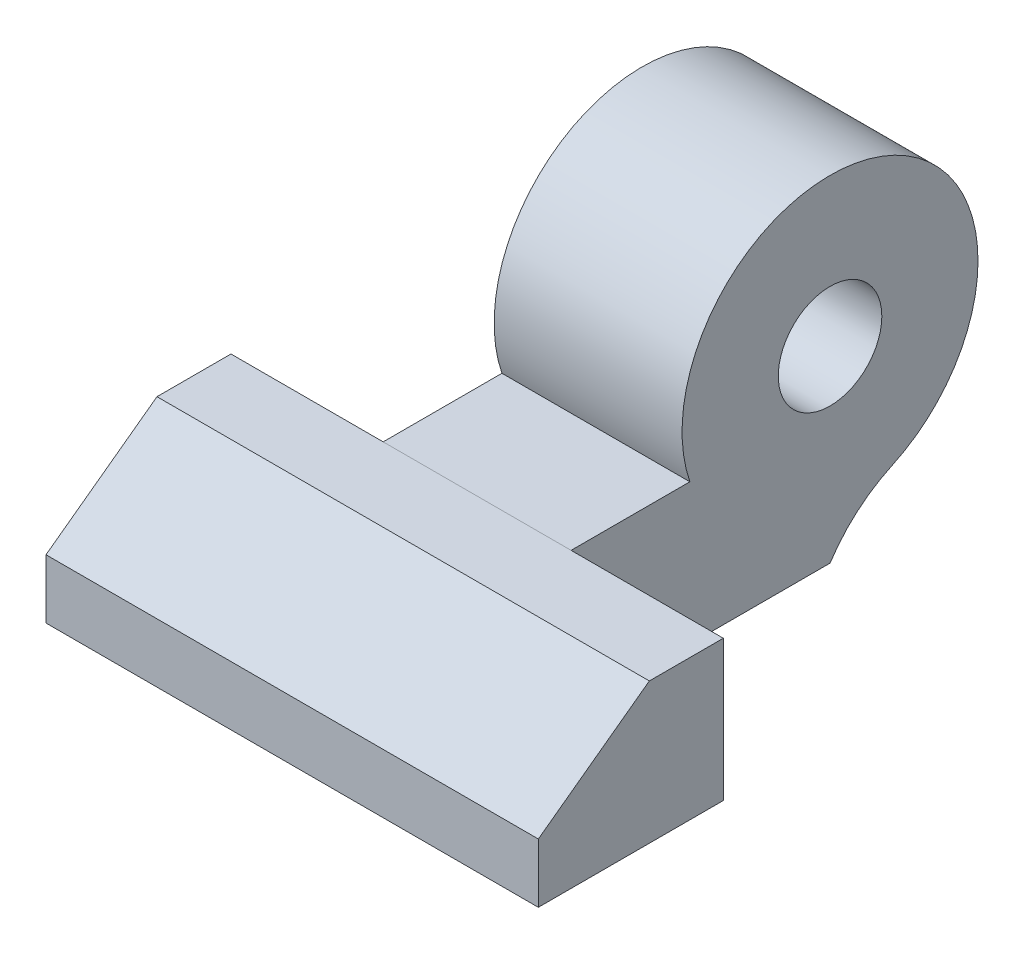
ISO-10303-21;
HEADER;
FILE_DESCRIPTION(('STEP AP214'),'2;1');
FILE_NAME('part.step','',(''),(''),'','','');
FILE_SCHEMA(('AUTOMOTIVE_DESIGN { 1 0 10303 214 1 1 1 1 }'));
ENDSEC;
DATA;
#1=APPLICATION_CONTEXT('core data for automotive mechanical design processes');
#2=APPLICATION_PROTOCOL_DEFINITION('international standard','automotive_design',2000,#1);
#3=PRODUCT_CONTEXT('',#1,'mechanical');
#4=PRODUCT('Part','Part','',(#3));
#5=PRODUCT_RELATED_PRODUCT_CATEGORY('part','',(#4));
#6=PRODUCT_DEFINITION_FORMATION('','',#4);
#7=PRODUCT_DEFINITION_CONTEXT('part definition',#1,'design');
#8=PRODUCT_DEFINITION('design','',#6,#7);
#9=PRODUCT_DEFINITION_SHAPE('','',#8);
#10=(LENGTH_UNIT() NAMED_UNIT(*) SI_UNIT(.MILLI.,.METRE.));
#11=(NAMED_UNIT(*) PLANE_ANGLE_UNIT() SI_UNIT($,.RADIAN.));
#12=(NAMED_UNIT(*) SI_UNIT($,.STERADIAN.) SOLID_ANGLE_UNIT());
#13=UNCERTAINTY_MEASURE_WITH_UNIT(LENGTH_MEASURE(1.E-05),#10,'distance_accuracy_value','');
#14=(GEOMETRIC_REPRESENTATION_CONTEXT(3) GLOBAL_UNCERTAINTY_ASSIGNED_CONTEXT((#13)) GLOBAL_UNIT_ASSIGNED_CONTEXT((#10,
#11,#12)) REPRESENTATION_CONTEXT('',''));
#15=CARTESIAN_POINT('',(0.,0.,0.));
#16=DIRECTION('',(0.,0.,1.));
#17=DIRECTION('',(1.,0.,0.));
#18=AXIS2_PLACEMENT_3D('',#15,#16,#17);
#19=CARTESIAN_POINT('',(16.637,0.,30.));
#20=DIRECTION('',(0.,0.,-1.));
#21=DIRECTION('',(-1.,0.,0.));
#22=AXIS2_PLACEMENT_3D('',#19,#20,#21);
#23=PLANE('',#22);
#24=DIRECTION('',(0.,-1.,0.));
#25=VECTOR('',#24,1.);
#26=CARTESIAN_POINT('',(-16.637,0.,30.));
#27=LINE('',#26,#25);
#28=CARTESIAN_POINT('',(-16.637,-8.70000000000001,30.));
#29=VERTEX_POINT('',#28);
#30=CARTESIAN_POINT('',(-16.637,-12.7,30.));
#31=VERTEX_POINT('',#30);
#32=EDGE_CURVE('E127',#29,#31,#27,.T.);
#33=ORIENTED_EDGE('',*,*,#32,.T.);
#34=DIRECTION('',(-1.,0.,0.));
#35=VECTOR('',#34,1.);
#36=CARTESIAN_POINT('',(16.637,-12.7,30.));
#37=LINE('',#36,#35);
#38=CARTESIAN_POINT('',(16.637,-12.7,30.));
#39=VERTEX_POINT('',#38);
#40=EDGE_CURVE('E12',#39,#31,#37,.T.);
#41=ORIENTED_EDGE('',*,*,#40,.F.);
#42=DIRECTION('',(0.,-1.,0.));
#43=VECTOR('',#42,1.);
#44=CARTESIAN_POINT('',(16.637,0.,30.));
#45=LINE('',#44,#43);
#46=CARTESIAN_POINT('',(16.637,-8.70000000000001,30.));
#47=VERTEX_POINT('',#46);
#48=EDGE_CURVE('E121',#47,#39,#45,.T.);
#49=ORIENTED_EDGE('',*,*,#48,.F.);
#50=DIRECTION('',(-1.,0.,0.));
#51=VECTOR('',#50,1.);
#52=CARTESIAN_POINT('',(16.637,-8.70000000000001,30.));
#53=LINE('',#52,#51);
#54=EDGE_CURVE('E126',#47,#29,#53,.T.);
#55=ORIENTED_EDGE('',*,*,#54,.T.);
#56=EDGE_LOOP('',(#33,#41,#49,#55));
#57=FACE_BOUND('',#56,.T.);
#58=ADVANCED_FACE('F52',(#57),#23,.F.);
#59=CARTESIAN_POINT('',(16.637,-12.7,0.));
#60=DIRECTION('',(0.,1.,0.));
#61=DIRECTION('',(0.,0.,1.));
#62=AXIS2_PLACEMENT_3D('',#59,#60,#61);
#63=PLANE('',#62);
#64=DIRECTION('',(0.,0.,-1.));
#65=VECTOR('',#64,1.);
#66=CARTESIAN_POINT('',(-16.637,-12.7,0.));
#67=LINE('',#66,#65);
#68=CARTESIAN_POINT('',(-16.637,-12.7,17.5));
#69=VERTEX_POINT('',#68);
#70=EDGE_CURVE('E130',#31,#69,#67,.T.);
#71=ORIENTED_EDGE('',*,*,#70,.T.);
#72=DIRECTION('',(-1.,0.,0.));
#73=VECTOR('',#72,1.);
#74=CARTESIAN_POINT('',(16.637,-12.7,17.5));
#75=LINE('',#74,#73);
#76=CARTESIAN_POINT('',(16.637,-12.7,17.5));
#77=VERTEX_POINT('',#76);
#78=EDGE_CURVE('E60',#77,#69,#75,.T.);
#79=ORIENTED_EDGE('',*,*,#78,.F.);
#80=DIRECTION('',(0.,0.,-1.));
#81=VECTOR('',#80,1.);
#82=CARTESIAN_POINT('',(16.637,-12.7,0.));
#83=LINE('',#82,#81);
#84=EDGE_CURVE('E101',#39,#77,#83,.T.);
#85=ORIENTED_EDGE('',*,*,#84,.F.);
#86=ORIENTED_EDGE('',*,*,#40,.T.);
#87=EDGE_LOOP('',(#71,#79,#85,#86));
#88=FACE_BOUND('',#87,.T.);
#89=ADVANCED_FACE('F137',(#88),#63,.F.);
#90=CARTESIAN_POINT('',(16.637,0.,17.5));
#91=DIRECTION('',(0.,0.,-1.));
#92=DIRECTION('',(0.,1.,0.));
#93=AXIS2_PLACEMENT_3D('',#90,#91,#92);
#94=PLANE('',#93);
#95=DIRECTION('',(0.,-1.,0.));
#96=VECTOR('',#95,1.);
#97=CARTESIAN_POINT('',(-16.637,0.,17.5));
#98=LINE('',#97,#96);
#99=CARTESIAN_POINT('',(-16.637,-3.2,17.5));
#100=VERTEX_POINT('',#99);
#101=EDGE_CURVE('E113',#100,#69,#98,.T.);
#102=ORIENTED_EDGE('',*,*,#101,.F.);
#103=DIRECTION('',(-1.,0.,0.));
#104=VECTOR('',#103,1.);
#105=CARTESIAN_POINT('',(16.637,-3.2,17.5));
#106=LINE('',#105,#104);
#107=CARTESIAN_POINT('',(16.637,-3.2,17.5));
#108=VERTEX_POINT('',#107);
#109=EDGE_CURVE('E107',#108,#100,#106,.T.);
#110=ORIENTED_EDGE('',*,*,#109,.F.);
#111=DIRECTION('',(0.,-1.,0.));
#112=VECTOR('',#111,1.);
#113=CARTESIAN_POINT('',(16.637,0.,17.5));
#114=LINE('',#113,#112);
#115=EDGE_CURVE('E111',#108,#77,#114,.T.);
#116=ORIENTED_EDGE('',*,*,#115,.T.);
#117=ORIENTED_EDGE('',*,*,#78,.T.);
#118=EDGE_LOOP('',(#102,#110,#116,#117));
#119=FACE_BOUND('',#118,.T.);
#120=ADVANCED_FACE('F109',(#119),#94,.T.);
#121=CARTESIAN_POINT('',(16.637,-3.2,0.));
#122=DIRECTION('',(0.,-1.,0.));
#123=DIRECTION('',(0.,0.,-1.));
#124=AXIS2_PLACEMENT_3D('',#121,#122,#123);
#125=PLANE('',#124);
#126=DIRECTION('',(0.,0.,1.));
#127=VECTOR('',#126,1.);
#128=CARTESIAN_POINT('',(-16.637,-3.2,0.));
#129=LINE('',#128,#127);
#130=CARTESIAN_POINT('',(-16.637,-3.2,22.5));
#131=VERTEX_POINT('',#130);
#132=EDGE_CURVE('E87',#100,#131,#129,.T.);
#133=ORIENTED_EDGE('',*,*,#132,.T.);
#134=DIRECTION('',(-1.,0.,0.));
#135=VECTOR('',#134,1.);
#136=CARTESIAN_POINT('',(16.637,-3.2,22.5));
#137=LINE('',#136,#135);
#138=CARTESIAN_POINT('',(16.637,-3.2,22.5));
#139=VERTEX_POINT('',#138);
#140=EDGE_CURVE('E114',#139,#131,#137,.T.);
#141=ORIENTED_EDGE('',*,*,#140,.F.);
#142=DIRECTION('',(0.,0.,1.));
#143=VECTOR('',#142,1.);
#144=CARTESIAN_POINT('',(16.637,-3.2,0.));
#145=LINE('',#144,#143);
#146=EDGE_CURVE('E116',#108,#139,#145,.T.);
#147=ORIENTED_EDGE('',*,*,#146,.F.);
#148=ORIENTED_EDGE('',*,*,#109,.T.);
#149=EDGE_LOOP('',(#133,#141,#147,#148));
#150=FACE_BOUND('',#149,.T.);
#151=ADVANCED_FACE('F117',(#150),#125,.F.);
#152=CARTESIAN_POINT('',(16.637,8.64884393063584,6.34248554913295));
#153=DIRECTION('',(0.,-0.806404995855705,-0.591363663627518));
#154=DIRECTION('',(0.,0.591363663627518,-0.806404995855705));
#155=AXIS2_PLACEMENT_3D('',#152,#153,#154);
#156=PLANE('',#155);
#157=DIRECTION('',(0.,-0.591363663627518,0.806404995855705));
#158=VECTOR('',#157,1.);
#159=CARTESIAN_POINT('',(-16.637,8.64884393063584,6.34248554913295));
#160=LINE('',#159,#158);
#161=EDGE_CURVE('E93',#131,#29,#160,.T.);
#162=ORIENTED_EDGE('',*,*,#161,.T.);
#163=ORIENTED_EDGE('',*,*,#54,.F.);
#164=DIRECTION('',(0.,-0.591363663627518,0.806404995855705));
#165=VECTOR('',#164,1.);
#166=CARTESIAN_POINT('',(16.637,8.64884393063584,6.34248554913295));
#167=LINE('',#166,#165);
#168=EDGE_CURVE('E68',#139,#47,#167,.T.);
#169=ORIENTED_EDGE('',*,*,#168,.F.);
#170=ORIENTED_EDGE('',*,*,#140,.T.);
#171=EDGE_LOOP('',(#162,#163,#169,#170));
#172=FACE_BOUND('',#171,.T.);
#173=ADVANCED_FACE('F144',(#172),#156,.F.);
#174=CARTESIAN_POINT('',(16.637,0.,0.));
#175=DIRECTION('',(1.,0.,0.));
#176=DIRECTION('',(0.,0.,-1.));
#177=AXIS2_PLACEMENT_3D('',#174,#175,#176);
#178=PLANE('',#177);
#179=ORIENTED_EDGE('',*,*,#48,.T.);
#180=ORIENTED_EDGE('',*,*,#84,.T.);
#181=ORIENTED_EDGE('',*,*,#115,.F.);
#182=ORIENTED_EDGE('',*,*,#146,.T.);
#183=ORIENTED_EDGE('',*,*,#168,.T.);
#184=EDGE_LOOP('',(#179,#180,#181,#182,#183));
#185=FACE_BOUND('',#184,.T.);
#186=ADVANCED_FACE('F119',(#185),#178,.T.);
#187=CARTESIAN_POINT('',(-16.637,0.,0.));
#188=DIRECTION('',(1.,0.,0.));
#189=DIRECTION('',(0.,0.,-1.));
#190=AXIS2_PLACEMENT_3D('',#187,#188,#189);
#191=PLANE('',#190);
#192=ORIENTED_EDGE('',*,*,#32,.F.);
#193=ORIENTED_EDGE('',*,*,#161,.F.);
#194=ORIENTED_EDGE('',*,*,#132,.F.);
#195=ORIENTED_EDGE('',*,*,#101,.T.);
#196=ORIENTED_EDGE('',*,*,#70,.F.);
#197=EDGE_LOOP('',(#192,#193,#194,#195,#196));
#198=FACE_BOUND('',#197,.T.);
#199=ADVANCED_FACE('F141',(#198),#191,.F.);
#200=CLOSED_SHELL('',(#58,#89,#120,#151,#173,#186,#199));
#201=MANIFOLD_SOLID_BREP('B2',#200);
#202=CARTESIAN_POINT('',(6.35,0.,0.));
#203=DIRECTION('',(1.,0.,0.));
#204=DIRECTION('',(0.,0.,-1.));
#205=AXIS2_PLACEMENT_3D('',#202,#203,#204);
#206=PLANE('',#205);
#207=DIRECTION('',(0.,0.,-1.));
#208=VECTOR('',#207,1.);
#209=CARTESIAN_POINT('',(6.35,-12.7,0.));
#210=LINE('',#209,#208);
#211=CARTESIAN_POINT('',(6.35,-12.7,30.));
#212=VERTEX_POINT('',#211);
#213=CARTESIAN_POINT('',(6.35,-12.7,0.));
#214=VERTEX_POINT('',#213);
#215=EDGE_CURVE('E306',#212,#214,#210,.T.);
#216=ORIENTED_EDGE('',*,*,#215,.T.);
#217=CARTESIAN_POINT('',(6.35,-18.1610236220472,-8.37718455087639));
#218=DIRECTION('',(1.,0.,0.));
#219=DIRECTION('',(0.,0.,-1.));
#220=AXIS2_PLACEMENT_3D('',#217,#218,#219);
#221=CIRCLE('',#220,10.);
#222=CARTESIAN_POINT('',(6.35,-9.08051181102362,-4.18859227543819));
#223=VERTEX_POINT('',#222);
#224=EDGE_CURVE('E50',#214,#223,#221,.F.);
#225=ORIENTED_EDGE('',*,*,#224,.T.);
#226=CARTESIAN_POINT('',(6.35,0.,0.));
#227=DIRECTION('',(1.,0.,0.));
#228=DIRECTION('',(0.,0.,-1.));
#229=AXIS2_PLACEMENT_3D('',#226,#227,#228);
#230=CIRCLE('',#229,10.);
#231=CARTESIAN_POINT('',(6.35,-3.2,9.47417542586161));
#232=VERTEX_POINT('',#231);
#233=EDGE_CURVE('E277',#223,#232,#230,.T.);
#234=ORIENTED_EDGE('',*,*,#233,.T.);
#235=DIRECTION('',(0.,0.,1.));
#236=VECTOR('',#235,1.);
#237=CARTESIAN_POINT('',(6.35,-3.2,22.5));
#238=LINE('',#237,#236);
#239=CARTESIAN_POINT('',(6.35,-3.2,22.5));
#240=VERTEX_POINT('',#239);
#241=EDGE_CURVE('E281',#232,#240,#238,.T.);
#242=ORIENTED_EDGE('',*,*,#241,.T.);
#243=DIRECTION('',(0.,-0.591363663627518,0.806404995855705));
#244=VECTOR('',#243,1.);
#245=CARTESIAN_POINT('',(6.35,-8.7,30.));
#246=LINE('',#245,#244);
#247=CARTESIAN_POINT('',(6.35,-8.7,30.));
#248=VERTEX_POINT('',#247);
#249=EDGE_CURVE('E299',#240,#248,#246,.T.);
#250=ORIENTED_EDGE('',*,*,#249,.T.);
#251=DIRECTION('',(0.,-1.,0.));
#252=VECTOR('',#251,1.);
#253=CARTESIAN_POINT('',(6.35,-12.7,30.));
#254=LINE('',#253,#252);
#255=EDGE_CURVE('E301',#248,#212,#254,.T.);
#256=ORIENTED_EDGE('',*,*,#255,.T.);
#257=EDGE_LOOP('',(#216,#225,#234,#242,#250,#256));
#258=FACE_BOUND('',#257,.T.);
#259=CARTESIAN_POINT('',(6.35,0.,0.));
#260=DIRECTION('',(1.,0.,0.));
#261=DIRECTION('',(0.,0.,-1.));
#262=AXIS2_PLACEMENT_3D('',#259,#260,#261);
#263=CIRCLE('',#262,3.5);
#264=CARTESIAN_POINT('',(6.35,0.,-3.5));
#265=VERTEX_POINT('',#264);
#266=EDGE_CURVE('E311',#265,#265,#263,.T.);
#267=ORIENTED_EDGE('',*,*,#266,.F.);
#268=EDGE_LOOP('',(#267));
#269=FACE_BOUND('',#268,.T.);
#270=ADVANCED_FACE('F229',(#258,#269),#206,.T.);
#271=CARTESIAN_POINT('',(-6.35,0.,0.));
#272=DIRECTION('',(1.,0.,0.));
#273=DIRECTION('',(0.,0.,-1.));
#274=AXIS2_PLACEMENT_3D('',#271,#272,#273);
#275=PLANE('',#274);
#276=CARTESIAN_POINT('',(-6.35,0.,0.));
#277=DIRECTION('',(1.,0.,0.));
#278=DIRECTION('',(0.,0.,-1.));
#279=AXIS2_PLACEMENT_3D('',#276,#277,#278);
#280=CIRCLE('',#279,10.);
#281=CARTESIAN_POINT('',(-6.35,-9.08051181102362,-4.18859227543819));
#282=VERTEX_POINT('',#281);
#283=CARTESIAN_POINT('',(-6.35,-3.2,9.47417542586161));
#284=VERTEX_POINT('',#283);
#285=EDGE_CURVE('E290',#282,#284,#280,.T.);
#286=ORIENTED_EDGE('',*,*,#285,.F.);
#287=CARTESIAN_POINT('',(-6.35,-18.1610236220472,-8.37718455087639));
#288=DIRECTION('',(1.,0.,0.));
#289=DIRECTION('',(0.,0.,-1.));
#290=AXIS2_PLACEMENT_3D('',#287,#288,#289);
#291=CIRCLE('',#290,10.);
#292=CARTESIAN_POINT('',(-6.35,-12.7,0.));
#293=VERTEX_POINT('',#292);
#294=EDGE_CURVE('E237',#282,#293,#291,.T.);
#295=ORIENTED_EDGE('',*,*,#294,.T.);
#296=DIRECTION('',(0.,0.,-1.));
#297=VECTOR('',#296,1.);
#298=CARTESIAN_POINT('',(-6.35,-12.7,0.));
#299=LINE('',#298,#297);
#300=CARTESIAN_POINT('',(-6.35,-12.7,30.));
#301=VERTEX_POINT('',#300);
#302=EDGE_CURVE('E284',#301,#293,#299,.T.);
#303=ORIENTED_EDGE('',*,*,#302,.F.);
#304=DIRECTION('',(0.,-1.,0.));
#305=VECTOR('',#304,1.);
#306=CARTESIAN_POINT('',(-6.35,-12.7,30.));
#307=LINE('',#306,#305);
#308=CARTESIAN_POINT('',(-6.35,-8.7,30.));
#309=VERTEX_POINT('',#308);
#310=EDGE_CURVE('E315',#309,#301,#307,.T.);
#311=ORIENTED_EDGE('',*,*,#310,.F.);
#312=DIRECTION('',(0.,-0.591363663627518,0.806404995855705));
#313=VECTOR('',#312,1.);
#314=CARTESIAN_POINT('',(-6.35,-8.7,30.));
#315=LINE('',#314,#313);
#316=CARTESIAN_POINT('',(-6.35,-3.2,22.5));
#317=VERTEX_POINT('',#316);
#318=EDGE_CURVE('E313',#317,#309,#315,.T.);
#319=ORIENTED_EDGE('',*,*,#318,.F.);
#320=DIRECTION('',(0.,0.,1.));
#321=VECTOR('',#320,1.);
#322=CARTESIAN_POINT('',(-6.35,-3.2,22.5));
#323=LINE('',#322,#321);
#324=EDGE_CURVE('E310',#284,#317,#323,.T.);
#325=ORIENTED_EDGE('',*,*,#324,.F.);
#326=EDGE_LOOP('',(#286,#295,#303,#311,#319,#325));
#327=FACE_BOUND('',#326,.T.);
#328=CARTESIAN_POINT('',(-6.35,0.,0.));
#329=DIRECTION('',(1.,0.,0.));
#330=DIRECTION('',(0.,0.,-1.));
#331=AXIS2_PLACEMENT_3D('',#328,#329,#330);
#332=CIRCLE('',#331,3.5);
#333=CARTESIAN_POINT('',(-6.35,0.,-3.5));
#334=VERTEX_POINT('',#333);
#335=EDGE_CURVE('E457',#334,#334,#332,.T.);
#336=ORIENTED_EDGE('',*,*,#335,.T.);
#337=EDGE_LOOP('',(#336));
#338=FACE_BOUND('',#337,.T.);
#339=ADVANCED_FACE('F329',(#327,#338),#275,.F.);
#340=CARTESIAN_POINT('',(6.35,0.,0.));
#341=DIRECTION('',(-1.,0.,0.));
#342=DIRECTION('',(0.,0.,1.));
#343=AXIS2_PLACEMENT_3D('',#340,#341,#342);
#344=CYLINDRICAL_SURFACE('',#343,10.);
#345=ORIENTED_EDGE('',*,*,#233,.F.);
#346=DIRECTION('',(-1.,0.,0.));
#347=VECTOR('',#346,1.);
#348=CARTESIAN_POINT('',(6.35,-9.08051181102362,-4.18859227543819));
#349=LINE('',#348,#347);
#350=EDGE_CURVE('E293',#223,#282,#349,.T.);
#351=ORIENTED_EDGE('',*,*,#350,.T.);
#352=ORIENTED_EDGE('',*,*,#285,.T.);
#353=DIRECTION('',(-1.,0.,0.));
#354=VECTOR('',#353,1.);
#355=CARTESIAN_POINT('',(6.35,-3.2,9.47417542586161));
#356=LINE('',#355,#354);
#357=EDGE_CURVE('E287',#232,#284,#356,.T.);
#358=ORIENTED_EDGE('',*,*,#357,.F.);
#359=EDGE_LOOP('',(#345,#351,#352,#358));
#360=FACE_BOUND('',#359,.T.);
#361=ADVANCED_FACE('F288',(#360),#344,.T.);
#362=CARTESIAN_POINT('',(6.35,-3.2,22.5));
#363=DIRECTION('',(0.,-1.,0.));
#364=DIRECTION('',(0.,0.,-1.));
#365=AXIS2_PLACEMENT_3D('',#362,#363,#364);
#366=PLANE('',#365);
#367=ORIENTED_EDGE('',*,*,#324,.T.);
#368=DIRECTION('',(-1.,0.,0.));
#369=VECTOR('',#368,1.);
#370=CARTESIAN_POINT('',(6.35,-3.2,22.5));
#371=LINE('',#370,#369);
#372=EDGE_CURVE('E294',#240,#317,#371,.T.);
#373=ORIENTED_EDGE('',*,*,#372,.F.);
#374=ORIENTED_EDGE('',*,*,#241,.F.);
#375=ORIENTED_EDGE('',*,*,#357,.T.);
#376=EDGE_LOOP('',(#367,#373,#374,#375));
#377=FACE_BOUND('',#376,.T.);
#378=ADVANCED_FACE('F296',(#377),#366,.F.);
#379=CARTESIAN_POINT('',(6.35,-8.7,30.));
#380=DIRECTION('',(0.,-0.806404995855705,-0.591363663627518));
#381=DIRECTION('',(0.,0.591363663627518,-0.806404995855705));
#382=AXIS2_PLACEMENT_3D('',#379,#380,#381);
#383=PLANE('',#382);
#384=ORIENTED_EDGE('',*,*,#318,.T.);
#385=DIRECTION('',(-1.,0.,0.));
#386=VECTOR('',#385,1.);
#387=CARTESIAN_POINT('',(6.35,-8.7,30.));
#388=LINE('',#387,#386);
#389=EDGE_CURVE('E323',#248,#309,#388,.T.);
#390=ORIENTED_EDGE('',*,*,#389,.F.);
#391=ORIENTED_EDGE('',*,*,#249,.F.);
#392=ORIENTED_EDGE('',*,*,#372,.T.);
#393=EDGE_LOOP('',(#384,#390,#391,#392));
#394=FACE_BOUND('',#393,.T.);
#395=ADVANCED_FACE('F356',(#394),#383,.F.);
#396=CARTESIAN_POINT('',(6.35,-12.7,30.));
#397=DIRECTION('',(0.,0.,-1.));
#398=DIRECTION('',(-1.,0.,0.));
#399=AXIS2_PLACEMENT_3D('',#396,#397,#398);
#400=PLANE('',#399);
#401=ORIENTED_EDGE('',*,*,#310,.T.);
#402=DIRECTION('',(-1.,0.,0.));
#403=VECTOR('',#402,1.);
#404=CARTESIAN_POINT('',(6.35,-12.7,30.));
#405=LINE('',#404,#403);
#406=EDGE_CURVE('E320',#212,#301,#405,.T.);
#407=ORIENTED_EDGE('',*,*,#406,.F.);
#408=ORIENTED_EDGE('',*,*,#255,.F.);
#409=ORIENTED_EDGE('',*,*,#389,.T.);
#410=EDGE_LOOP('',(#401,#407,#408,#409));
#411=FACE_BOUND('',#410,.T.);
#412=ADVANCED_FACE('F353',(#411),#400,.F.);
#413=CARTESIAN_POINT('',(6.35,-12.7,0.));
#414=DIRECTION('',(0.,1.,0.));
#415=DIRECTION('',(0.,0.,1.));
#416=AXIS2_PLACEMENT_3D('',#413,#414,#415);
#417=PLANE('',#416);
#418=ORIENTED_EDGE('',*,*,#302,.T.);
#419=DIRECTION('',(-1.,0.,0.));
#420=VECTOR('',#419,1.);
#421=CARTESIAN_POINT('',(6.35,-12.7,0.));
#422=LINE('',#421,#420);
#423=EDGE_CURVE('E308',#214,#293,#422,.T.);
#424=ORIENTED_EDGE('',*,*,#423,.F.);
#425=ORIENTED_EDGE('',*,*,#215,.F.);
#426=ORIENTED_EDGE('',*,*,#406,.T.);
#427=EDGE_LOOP('',(#418,#424,#425,#426));
#428=FACE_BOUND('',#427,.T.);
#429=ADVANCED_FACE('F334',(#428),#417,.F.);
#430=CARTESIAN_POINT('',(6.35,0.,0.));
#431=DIRECTION('',(-1.,0.,0.));
#432=DIRECTION('',(0.,0.,1.));
#433=AXIS2_PLACEMENT_3D('',#430,#431,#432);
#434=CYLINDRICAL_SURFACE('',#433,3.5);
#435=ORIENTED_EDGE('',*,*,#266,.T.);
#436=EDGE_LOOP('',(#435));
#437=FACE_BOUND('',#436,.T.);
#438=ORIENTED_EDGE('',*,*,#335,.F.);
#439=EDGE_LOOP('',(#438));
#440=FACE_BOUND('',#439,.T.);
#441=ADVANCED_FACE('F338',(#437,#440),#434,.F.);
#442=CARTESIAN_POINT('',(6.35,-18.1610236220472,-8.37718455087639));
#443=DIRECTION('',(1.,0.,0.));
#444=DIRECTION('',(0.,0.,-1.));
#445=AXIS2_PLACEMENT_3D('',#442,#443,#444);
#446=CYLINDRICAL_SURFACE('',#445,10.);
#447=ORIENTED_EDGE('',*,*,#224,.F.);
#448=ORIENTED_EDGE('',*,*,#423,.T.);
#449=ORIENTED_EDGE('',*,*,#294,.F.);
#450=ORIENTED_EDGE('',*,*,#350,.F.);
#451=EDGE_LOOP('',(#447,#448,#449,#450));
#452=FACE_BOUND('',#451,.T.);
#453=ADVANCED_FACE('F231',(#452),#446,.F.);
#454=CLOSED_SHELL('',(#270,#339,#361,#378,#395,#412,#429,#441,#453));
#455=MANIFOLD_SOLID_BREP('B6',#454);
#456=ADVANCED_BREP_SHAPE_REPRESENTATION('',(#18,#201,#455),#14);
#457=SHAPE_DEFINITION_REPRESENTATION(#9,#456);
ENDSEC;
END-ISO-10303-21;
